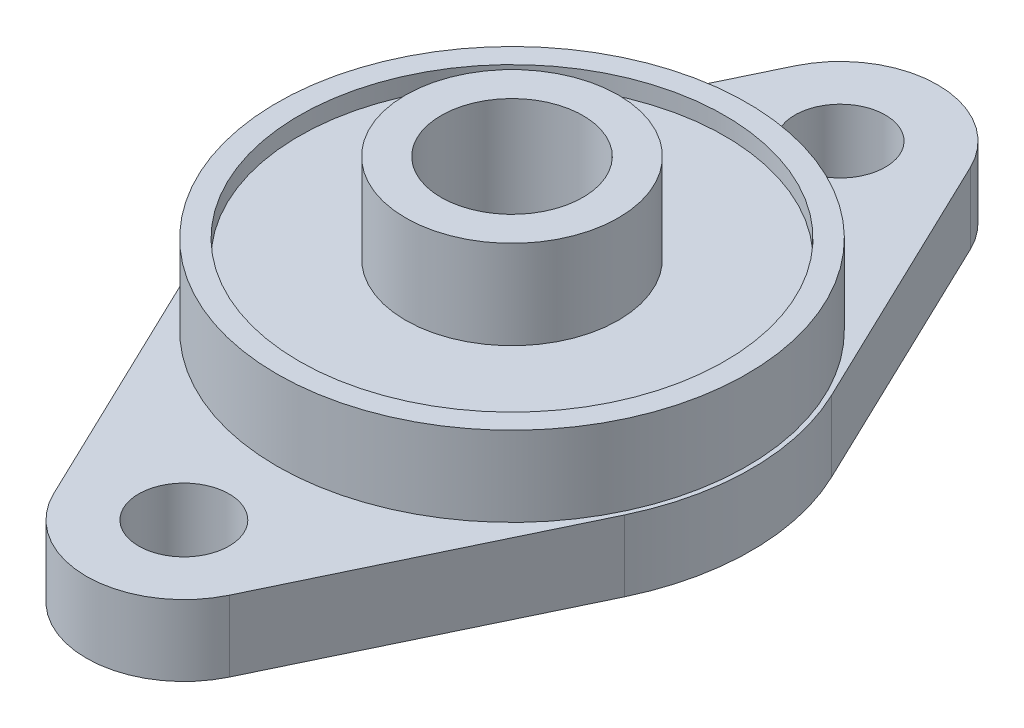
ISO-10303-21;
HEADER;
FILE_DESCRIPTION(('STEP AP214'),'2;1');
FILE_NAME('part.step','',(''),(''),'','','');
FILE_SCHEMA(('AUTOMOTIVE_DESIGN { 1 0 10303 214 1 1 1 1 }'));
ENDSEC;
DATA;
#1=APPLICATION_CONTEXT('core data for automotive mechanical design processes');
#2=APPLICATION_PROTOCOL_DEFINITION('international standard','automotive_design',2000,#1);
#3=PRODUCT_CONTEXT('',#1,'mechanical');
#4=PRODUCT('Part','Part','',(#3));
#5=PRODUCT_RELATED_PRODUCT_CATEGORY('part','',(#4));
#6=PRODUCT_DEFINITION_FORMATION('','',#4);
#7=PRODUCT_DEFINITION_CONTEXT('part definition',#1,'design');
#8=PRODUCT_DEFINITION('design','',#6,#7);
#9=PRODUCT_DEFINITION_SHAPE('','',#8);
#10=(LENGTH_UNIT() NAMED_UNIT(*) SI_UNIT(.MILLI.,.METRE.));
#11=(NAMED_UNIT(*) PLANE_ANGLE_UNIT() SI_UNIT($,.RADIAN.));
#12=(NAMED_UNIT(*) SI_UNIT($,.STERADIAN.) SOLID_ANGLE_UNIT());
#13=UNCERTAINTY_MEASURE_WITH_UNIT(LENGTH_MEASURE(1.E-05),#10,'distance_accuracy_value','');
#14=(GEOMETRIC_REPRESENTATION_CONTEXT(3) GLOBAL_UNCERTAINTY_ASSIGNED_CONTEXT((#13)) GLOBAL_UNIT_ASSIGNED_CONTEXT((#10,
#11,#12)) REPRESENTATION_CONTEXT('',''));
#15=CARTESIAN_POINT('',(0.,0.,0.));
#16=DIRECTION('',(0.,0.,1.));
#17=DIRECTION('',(1.,0.,0.));
#18=AXIS2_PLACEMENT_3D('',#15,#16,#17);
#19=CARTESIAN_POINT('',(0.,4.,-18.5));
#20=DIRECTION('',(0.,1.,0.));
#21=DIRECTION('',(0.,0.,1.));
#22=AXIS2_PLACEMENT_3D('',#19,#20,#21);
#23=PLANE('',#22);
#24=CARTESIAN_POINT('',(0.,4.,0.));
#25=DIRECTION('',(0.,1.,0.));
#26=DIRECTION('',(0.,0.,1.));
#27=AXIS2_PLACEMENT_3D('',#24,#25,#26);
#28=CIRCLE('',#27,13.25);
#29=CARTESIAN_POINT('',(0.,4.,13.25));
#30=VERTEX_POINT('',#29);
#31=EDGE_CURVE('E225',#30,#30,#28,.T.);
#32=ORIENTED_EDGE('',*,*,#31,.F.);
#33=EDGE_LOOP('',(#32));
#34=FACE_BOUND('',#33,.T.);
#35=CARTESIAN_POINT('',(0.,4.,-18.5));
#36=DIRECTION('',(0.,1.,0.));
#37=DIRECTION('',(0.,0.,1.));
#38=AXIS2_PLACEMENT_3D('',#35,#36,#37);
#39=CIRCLE('',#38,2.55);
#40=CARTESIAN_POINT('',(0.,4.,-15.95));
#41=VERTEX_POINT('',#40);
#42=EDGE_CURVE('E146',#41,#41,#39,.T.);
#43=ORIENTED_EDGE('',*,*,#42,.F.);
#44=EDGE_LOOP('',(#43));
#45=FACE_BOUND('',#44,.T.);
#46=CARTESIAN_POINT('',(0.,4.,-18.5));
#47=DIRECTION('',(0.,1.,0.));
#48=DIRECTION('',(0.,0.,1.));
#49=AXIS2_PLACEMENT_3D('',#46,#47,#48);
#50=CIRCLE('',#49,5.5);
#51=CARTESIAN_POINT('',(4.95916487820905,4.,-20.8783783783784));
#52=VERTEX_POINT('',#51);
#53=CARTESIAN_POINT('',(-4.95916487820906,4.,-20.8783783783784));
#54=VERTEX_POINT('',#53);
#55=EDGE_CURVE('E164',#52,#54,#50,.T.);
#56=ORIENTED_EDGE('',*,*,#55,.T.);
#57=DIRECTION('',(-0.432432432432432,0.,0.901666341492556));
#58=VECTOR('',#57,1.);
#59=CARTESIAN_POINT('',(-4.95916487820906,4.,-20.8783783783784));
#60=LINE('',#59,#58);
#61=CARTESIAN_POINT('',(-12.1724956101495,4.,-5.83783783783783));
#62=VERTEX_POINT('',#61);
#63=EDGE_CURVE('E100',#54,#62,#60,.T.);
#64=ORIENTED_EDGE('',*,*,#63,.T.);
#65=CARTESIAN_POINT('',(0.,4.,0.));
#66=DIRECTION('',(0.,1.,0.));
#67=DIRECTION('',(0.,0.,1.));
#68=AXIS2_PLACEMENT_3D('',#65,#66,#67);
#69=CIRCLE('',#68,13.5);
#70=CARTESIAN_POINT('',(-12.1724956101495,4.,5.83783783783784));
#71=VERTEX_POINT('',#70);
#72=EDGE_CURVE('E185',#62,#71,#69,.T.);
#73=ORIENTED_EDGE('',*,*,#72,.T.);
#74=DIRECTION('',(0.432432432432432,0.,0.901666341492555));
#75=VECTOR('',#74,1.);
#76=CARTESIAN_POINT('',(-12.1724956101495,4.,5.83783783783784));
#77=LINE('',#76,#75);
#78=CARTESIAN_POINT('',(-4.95916487820905,4.,20.8783783783784));
#79=VERTEX_POINT('',#78);
#80=EDGE_CURVE('E199',#71,#79,#77,.T.);
#81=ORIENTED_EDGE('',*,*,#80,.T.);
#82=CARTESIAN_POINT('',(0.,4.,18.5));
#83=DIRECTION('',(0.,1.,0.));
#84=DIRECTION('',(0.,0.,1.));
#85=AXIS2_PLACEMENT_3D('',#82,#83,#84);
#86=CIRCLE('',#85,5.5);
#87=CARTESIAN_POINT('',(4.95916487820906,4.,20.8783783783784));
#88=VERTEX_POINT('',#87);
#89=EDGE_CURVE('E119',#79,#88,#86,.T.);
#90=ORIENTED_EDGE('',*,*,#89,.T.);
#91=DIRECTION('',(0.432432432432432,0.,-0.901666341492556));
#92=VECTOR('',#91,1.);
#93=CARTESIAN_POINT('',(12.1724956101495,4.,5.83783783783784));
#94=LINE('',#93,#92);
#95=CARTESIAN_POINT('',(12.1724956101495,4.,5.83783783783784));
#96=VERTEX_POINT('',#95);
#97=EDGE_CURVE('E113',#88,#96,#94,.T.);
#98=ORIENTED_EDGE('',*,*,#97,.T.);
#99=CARTESIAN_POINT('',(0.,4.,0.));
#100=DIRECTION('',(0.,1.,0.));
#101=DIRECTION('',(0.,0.,1.));
#102=AXIS2_PLACEMENT_3D('',#99,#100,#101);
#103=CIRCLE('',#102,13.5);
#104=CARTESIAN_POINT('',(12.1724956101495,4.,-5.83783783783784));
#105=VERTEX_POINT('',#104);
#106=EDGE_CURVE('E117',#96,#105,#103,.T.);
#107=ORIENTED_EDGE('',*,*,#106,.T.);
#108=DIRECTION('',(-0.432432432432433,0.,-0.901666341492555));
#109=VECTOR('',#108,1.);
#110=CARTESIAN_POINT('',(4.95916487820905,4.,-20.8783783783784));
#111=LINE('',#110,#109);
#112=EDGE_CURVE('E57',#105,#52,#111,.T.);
#113=ORIENTED_EDGE('',*,*,#112,.T.);
#114=EDGE_LOOP('',(#56,#64,#73,#81,#90,#98,#107,#113));
#115=FACE_BOUND('',#114,.T.);
#116=CARTESIAN_POINT('',(0.,4.,18.5));
#117=DIRECTION('',(0.,1.,0.));
#118=DIRECTION('',(0.,0.,1.));
#119=AXIS2_PLACEMENT_3D('',#116,#117,#118);
#120=CIRCLE('',#119,2.55);
#121=CARTESIAN_POINT('',(0.,4.,21.05));
#122=VERTEX_POINT('',#121);
#123=EDGE_CURVE('E213',#122,#122,#120,.T.);
#124=ORIENTED_EDGE('',*,*,#123,.F.);
#125=EDGE_LOOP('',(#124));
#126=FACE_BOUND('',#125,.T.);
#127=ADVANCED_FACE('F39',(#34,#45,#115,#126),#23,.T.);
#128=CARTESIAN_POINT('',(0.,0.,-18.5));
#129=DIRECTION('',(0.,1.,0.));
#130=DIRECTION('',(0.,0.,1.));
#131=AXIS2_PLACEMENT_3D('',#128,#129,#130);
#132=PLANE('',#131);
#133=CARTESIAN_POINT('',(0.,0.,0.));
#134=DIRECTION('',(0.,1.,0.));
#135=DIRECTION('',(0.,0.,1.));
#136=AXIS2_PLACEMENT_3D('',#133,#134,#135);
#137=CIRCLE('',#136,4.);
#138=CARTESIAN_POINT('',(0.,0.,4.));
#139=VERTEX_POINT('',#138);
#140=EDGE_CURVE('E245',#139,#139,#137,.T.);
#141=ORIENTED_EDGE('',*,*,#140,.T.);
#142=EDGE_LOOP('',(#141));
#143=FACE_BOUND('',#142,.T.);
#144=CARTESIAN_POINT('',(0.,0.,-18.5));
#145=DIRECTION('',(0.,1.,0.));
#146=DIRECTION('',(0.,0.,1.));
#147=AXIS2_PLACEMENT_3D('',#144,#145,#146);
#148=CIRCLE('',#147,5.5);
#149=CARTESIAN_POINT('',(4.95916487820905,0.,-20.8783783783784));
#150=VERTEX_POINT('',#149);
#151=CARTESIAN_POINT('',(-4.95916487820906,0.,-20.8783783783784));
#152=VERTEX_POINT('',#151);
#153=EDGE_CURVE('E141',#150,#152,#148,.T.);
#154=ORIENTED_EDGE('',*,*,#153,.F.);
#155=DIRECTION('',(-0.432432432432433,0.,-0.901666341492555));
#156=VECTOR('',#155,1.);
#157=CARTESIAN_POINT('',(4.95916487820905,0.,-20.8783783783784));
#158=LINE('',#157,#156);
#159=CARTESIAN_POINT('',(12.1724956101495,0.,-5.83783783783784));
#160=VERTEX_POINT('',#159);
#161=EDGE_CURVE('E92',#160,#150,#158,.T.);
#162=ORIENTED_EDGE('',*,*,#161,.F.);
#163=CARTESIAN_POINT('',(0.,0.,0.));
#164=DIRECTION('',(0.,1.,0.));
#165=DIRECTION('',(0.,0.,1.));
#166=AXIS2_PLACEMENT_3D('',#163,#164,#165);
#167=CIRCLE('',#166,13.5);
#168=CARTESIAN_POINT('',(12.1724956101495,0.,5.83783783783784));
#169=VERTEX_POINT('',#168);
#170=EDGE_CURVE('E86',#169,#160,#167,.T.);
#171=ORIENTED_EDGE('',*,*,#170,.F.);
#172=DIRECTION('',(0.432432432432432,0.,-0.901666341492556));
#173=VECTOR('',#172,1.);
#174=CARTESIAN_POINT('',(12.1724956101495,0.,5.83783783783784));
#175=LINE('',#174,#173);
#176=CARTESIAN_POINT('',(4.95916487820906,0.,20.8783783783784));
#177=VERTEX_POINT('',#176);
#178=EDGE_CURVE('E128',#177,#169,#175,.T.);
#179=ORIENTED_EDGE('',*,*,#178,.F.);
#180=CARTESIAN_POINT('',(0.,0.,18.5));
#181=DIRECTION('',(0.,1.,0.));
#182=DIRECTION('',(0.,0.,1.));
#183=AXIS2_PLACEMENT_3D('',#180,#181,#182);
#184=CIRCLE('',#183,5.5);
#185=CARTESIAN_POINT('',(-4.95916487820905,0.,20.8783783783784));
#186=VERTEX_POINT('',#185);
#187=EDGE_CURVE('E155',#186,#177,#184,.T.);
#188=ORIENTED_EDGE('',*,*,#187,.F.);
#189=DIRECTION('',(0.432432432432432,0.,0.901666341492555));
#190=VECTOR('',#189,1.);
#191=CARTESIAN_POINT('',(-12.1724956101495,0.,5.83783783783784));
#192=LINE('',#191,#190);
#193=CARTESIAN_POINT('',(-12.1724956101495,0.,5.83783783783784));
#194=VERTEX_POINT('',#193);
#195=EDGE_CURVE('E152',#194,#186,#192,.T.);
#196=ORIENTED_EDGE('',*,*,#195,.F.);
#197=CARTESIAN_POINT('',(0.,0.,0.));
#198=DIRECTION('',(0.,1.,0.));
#199=DIRECTION('',(0.,0.,1.));
#200=AXIS2_PLACEMENT_3D('',#197,#198,#199);
#201=CIRCLE('',#200,13.5);
#202=CARTESIAN_POINT('',(-12.1724956101495,0.,-5.83783783783783));
#203=VERTEX_POINT('',#202);
#204=EDGE_CURVE('E149',#203,#194,#201,.T.);
#205=ORIENTED_EDGE('',*,*,#204,.F.);
#206=DIRECTION('',(-0.432432432432432,0.,0.901666341492556));
#207=VECTOR('',#206,1.);
#208=CARTESIAN_POINT('',(-4.95916487820906,0.,-20.8783783783784));
#209=LINE('',#208,#207);
#210=EDGE_CURVE('E145',#152,#203,#209,.T.);
#211=ORIENTED_EDGE('',*,*,#210,.F.);
#212=EDGE_LOOP('',(#154,#162,#171,#179,#188,#196,#205,#211));
#213=FACE_BOUND('',#212,.T.);
#214=CARTESIAN_POINT('',(0.,0.,-18.5));
#215=DIRECTION('',(0.,1.,0.));
#216=DIRECTION('',(0.,0.,1.));
#217=AXIS2_PLACEMENT_3D('',#214,#215,#216);
#218=CIRCLE('',#217,2.55);
#219=CARTESIAN_POINT('',(0.,0.,-15.95));
#220=VERTEX_POINT('',#219);
#221=EDGE_CURVE('E209',#220,#220,#218,.T.);
#222=ORIENTED_EDGE('',*,*,#221,.T.);
#223=EDGE_LOOP('',(#222));
#224=FACE_BOUND('',#223,.T.);
#225=CARTESIAN_POINT('',(0.,0.,18.5));
#226=DIRECTION('',(0.,1.,0.));
#227=DIRECTION('',(0.,0.,1.));
#228=AXIS2_PLACEMENT_3D('',#225,#226,#227);
#229=CIRCLE('',#228,2.55);
#230=CARTESIAN_POINT('',(0.,0.,21.05));
#231=VERTEX_POINT('',#230);
#232=EDGE_CURVE('E217',#231,#231,#229,.T.);
#233=ORIENTED_EDGE('',*,*,#232,.T.);
#234=EDGE_LOOP('',(#233));
#235=FACE_BOUND('',#234,.T.);
#236=ADVANCED_FACE('F189',(#143,#213,#224,#235),#132,.F.);
#237=CARTESIAN_POINT('',(0.,4.,-18.5));
#238=DIRECTION('',(0.,-1.,0.));
#239=DIRECTION('',(0.,0.,-1.));
#240=AXIS2_PLACEMENT_3D('',#237,#238,#239);
#241=CYLINDRICAL_SURFACE('',#240,5.5);
#242=ORIENTED_EDGE('',*,*,#153,.T.);
#243=DIRECTION('',(0.,-1.,0.));
#244=VECTOR('',#243,1.);
#245=CARTESIAN_POINT('',(-4.95916487820906,4.,-20.8783783783784));
#246=LINE('',#245,#244);
#247=EDGE_CURVE('E11',#54,#152,#246,.T.);
#248=ORIENTED_EDGE('',*,*,#247,.F.);
#249=ORIENTED_EDGE('',*,*,#55,.F.);
#250=DIRECTION('',(0.,-1.,0.));
#251=VECTOR('',#250,1.);
#252=CARTESIAN_POINT('',(4.95916487820905,4.,-20.8783783783784));
#253=LINE('',#252,#251);
#254=EDGE_CURVE('E137',#52,#150,#253,.T.);
#255=ORIENTED_EDGE('',*,*,#254,.T.);
#256=EDGE_LOOP('',(#242,#248,#249,#255));
#257=FACE_BOUND('',#256,.T.);
#258=ADVANCED_FACE('F41',(#257),#241,.T.);
#259=CARTESIAN_POINT('',(-4.95916487820906,4.,-20.8783783783784));
#260=DIRECTION('',(0.901666341492556,0.,0.432432432432432));
#261=DIRECTION('',(0.432432432432432,0.,-0.901666341492556));
#262=AXIS2_PLACEMENT_3D('',#259,#260,#261);
#263=PLANE('',#262);
#264=ORIENTED_EDGE('',*,*,#210,.T.);
#265=DIRECTION('',(0.,-1.,0.));
#266=VECTOR('',#265,1.);
#267=CARTESIAN_POINT('',(-12.1724956101495,4.,-5.83783783783783));
#268=LINE('',#267,#266);
#269=EDGE_CURVE('E49',#62,#203,#268,.T.);
#270=ORIENTED_EDGE('',*,*,#269,.F.);
#271=ORIENTED_EDGE('',*,*,#63,.F.);
#272=ORIENTED_EDGE('',*,*,#247,.T.);
#273=EDGE_LOOP('',(#264,#270,#271,#272));
#274=FACE_BOUND('',#273,.T.);
#275=ADVANCED_FACE('F334',(#274),#263,.F.);
#276=CARTESIAN_POINT('',(0.,4.,0.));
#277=DIRECTION('',(0.,-1.,0.));
#278=DIRECTION('',(0.,0.,-1.));
#279=AXIS2_PLACEMENT_3D('',#276,#277,#278);
#280=CYLINDRICAL_SURFACE('',#279,13.5);
#281=ORIENTED_EDGE('',*,*,#204,.T.);
#282=DIRECTION('',(0.,-1.,0.));
#283=VECTOR('',#282,1.);
#284=CARTESIAN_POINT('',(-12.1724956101495,4.,5.83783783783784));
#285=LINE('',#284,#283);
#286=EDGE_CURVE('E175',#71,#194,#285,.T.);
#287=ORIENTED_EDGE('',*,*,#286,.F.);
#288=ORIENTED_EDGE('',*,*,#72,.F.);
#289=ORIENTED_EDGE('',*,*,#269,.T.);
#290=EDGE_LOOP('',(#281,#287,#288,#289));
#291=FACE_BOUND('',#290,.T.);
#292=ADVANCED_FACE('F183',(#291),#280,.T.);
#293=CARTESIAN_POINT('',(-12.1724956101495,4.,5.83783783783784));
#294=DIRECTION('',(0.901666341492556,0.,-0.432432432432433));
#295=DIRECTION('',(-0.432432432432433,0.,-0.901666341492556));
#296=AXIS2_PLACEMENT_3D('',#293,#294,#295);
#297=PLANE('',#296);
#298=ORIENTED_EDGE('',*,*,#195,.T.);
#299=DIRECTION('',(0.,-1.,0.));
#300=VECTOR('',#299,1.);
#301=CARTESIAN_POINT('',(-4.95916487820905,4.,20.8783783783784));
#302=LINE('',#301,#300);
#303=EDGE_CURVE('E171',#79,#186,#302,.T.);
#304=ORIENTED_EDGE('',*,*,#303,.F.);
#305=ORIENTED_EDGE('',*,*,#80,.F.);
#306=ORIENTED_EDGE('',*,*,#286,.T.);
#307=EDGE_LOOP('',(#298,#304,#305,#306));
#308=FACE_BOUND('',#307,.T.);
#309=ADVANCED_FACE('F194',(#308),#297,.F.);
#310=CARTESIAN_POINT('',(0.,4.,18.5));
#311=DIRECTION('',(0.,-1.,0.));
#312=DIRECTION('',(0.,0.,-1.));
#313=AXIS2_PLACEMENT_3D('',#310,#311,#312);
#314=CYLINDRICAL_SURFACE('',#313,5.5);
#315=ORIENTED_EDGE('',*,*,#187,.T.);
#316=DIRECTION('',(0.,-1.,0.));
#317=VECTOR('',#316,1.);
#318=CARTESIAN_POINT('',(4.95916487820906,4.,20.8783783783784));
#319=LINE('',#318,#317);
#320=EDGE_CURVE('E130',#88,#177,#319,.T.);
#321=ORIENTED_EDGE('',*,*,#320,.F.);
#322=ORIENTED_EDGE('',*,*,#89,.F.);
#323=ORIENTED_EDGE('',*,*,#303,.T.);
#324=EDGE_LOOP('',(#315,#321,#322,#323));
#325=FACE_BOUND('',#324,.T.);
#326=ADVANCED_FACE('F197',(#325),#314,.T.);
#327=CARTESIAN_POINT('',(12.1724956101495,4.,5.83783783783784));
#328=DIRECTION('',(-0.901666341492556,0.,-0.432432432432432));
#329=DIRECTION('',(-0.432432432432432,0.,0.901666341492556));
#330=AXIS2_PLACEMENT_3D('',#327,#328,#329);
#331=PLANE('',#330);
#332=ORIENTED_EDGE('',*,*,#178,.T.);
#333=DIRECTION('',(0.,-1.,0.));
#334=VECTOR('',#333,1.);
#335=CARTESIAN_POINT('',(12.1724956101495,4.,5.83783783783784));
#336=LINE('',#335,#334);
#337=EDGE_CURVE('E125',#96,#169,#336,.T.);
#338=ORIENTED_EDGE('',*,*,#337,.F.);
#339=ORIENTED_EDGE('',*,*,#97,.F.);
#340=ORIENTED_EDGE('',*,*,#320,.T.);
#341=EDGE_LOOP('',(#332,#338,#339,#340));
#342=FACE_BOUND('',#341,.T.);
#343=ADVANCED_FACE('F126',(#342),#331,.F.);
#344=CARTESIAN_POINT('',(0.,4.,0.));
#345=DIRECTION('',(0.,-1.,0.));
#346=DIRECTION('',(0.,0.,-1.));
#347=AXIS2_PLACEMENT_3D('',#344,#345,#346);
#348=CYLINDRICAL_SURFACE('',#347,13.5);
#349=ORIENTED_EDGE('',*,*,#170,.T.);
#350=DIRECTION('',(0.,-1.,0.));
#351=VECTOR('',#350,1.);
#352=CARTESIAN_POINT('',(12.1724956101495,4.,-5.83783783783784));
#353=LINE('',#352,#351);
#354=EDGE_CURVE('E131',#105,#160,#353,.T.);
#355=ORIENTED_EDGE('',*,*,#354,.F.);
#356=ORIENTED_EDGE('',*,*,#106,.F.);
#357=ORIENTED_EDGE('',*,*,#337,.T.);
#358=EDGE_LOOP('',(#349,#355,#356,#357));
#359=FACE_BOUND('',#358,.T.);
#360=ADVANCED_FACE('F133',(#359),#348,.T.);
#361=CARTESIAN_POINT('',(4.95916487820905,4.,-20.8783783783784));
#362=DIRECTION('',(-0.901666341492555,0.,0.432432432432433));
#363=DIRECTION('',(0.432432432432433,0.,0.901666341492555));
#364=AXIS2_PLACEMENT_3D('',#361,#362,#363);
#365=PLANE('',#364);
#366=ORIENTED_EDGE('',*,*,#161,.T.);
#367=ORIENTED_EDGE('',*,*,#254,.F.);
#368=ORIENTED_EDGE('',*,*,#112,.F.);
#369=ORIENTED_EDGE('',*,*,#354,.T.);
#370=EDGE_LOOP('',(#366,#367,#368,#369));
#371=FACE_BOUND('',#370,.T.);
#372=ADVANCED_FACE('F309',(#371),#365,.F.);
#373=CARTESIAN_POINT('',(0.,4.,-18.5));
#374=DIRECTION('',(0.,-1.,0.));
#375=DIRECTION('',(0.,0.,-1.));
#376=AXIS2_PLACEMENT_3D('',#373,#374,#375);
#377=CYLINDRICAL_SURFACE('',#376,2.55);
#378=ORIENTED_EDGE('',*,*,#42,.T.);
#379=EDGE_LOOP('',(#378));
#380=FACE_BOUND('',#379,.T.);
#381=ORIENTED_EDGE('',*,*,#221,.F.);
#382=EDGE_LOOP('',(#381));
#383=FACE_BOUND('',#382,.T.);
#384=ADVANCED_FACE('F306',(#380,#383),#377,.F.);
#385=CARTESIAN_POINT('',(0.,4.,18.5));
#386=DIRECTION('',(0.,-1.,0.));
#387=DIRECTION('',(0.,0.,-1.));
#388=AXIS2_PLACEMENT_3D('',#385,#386,#387);
#389=CYLINDRICAL_SURFACE('',#388,2.55);
#390=ORIENTED_EDGE('',*,*,#123,.T.);
#391=EDGE_LOOP('',(#390));
#392=FACE_BOUND('',#391,.T.);
#393=ORIENTED_EDGE('',*,*,#232,.F.);
#394=EDGE_LOOP('',(#393));
#395=FACE_BOUND('',#394,.T.);
#396=ADVANCED_FACE('F297',(#392,#395),#389,.F.);
#397=CARTESIAN_POINT('',(0.,8.5,0.));
#398=DIRECTION('',(0.,-1.,0.));
#399=DIRECTION('',(0.,0.,-1.));
#400=AXIS2_PLACEMENT_3D('',#397,#398,#399);
#401=CYLINDRICAL_SURFACE('',#400,13.25);
#402=CARTESIAN_POINT('',(0.,8.5,0.));
#403=DIRECTION('',(0.,1.,0.));
#404=DIRECTION('',(0.,0.,1.));
#405=AXIS2_PLACEMENT_3D('',#402,#403,#404);
#406=CIRCLE('',#405,13.25);
#407=CARTESIAN_POINT('',(0.,8.5,13.25));
#408=VERTEX_POINT('',#407);
#409=EDGE_CURVE('E221',#408,#408,#406,.T.);
#410=ORIENTED_EDGE('',*,*,#409,.F.);
#411=EDGE_LOOP('',(#410));
#412=FACE_BOUND('',#411,.T.);
#413=ORIENTED_EDGE('',*,*,#31,.T.);
#414=EDGE_LOOP('',(#413));
#415=FACE_BOUND('',#414,.T.);
#416=ADVANCED_FACE('F291',(#412,#415),#401,.T.);
#417=CARTESIAN_POINT('',(0.,8.5,0.));
#418=DIRECTION('',(0.,1.,0.));
#419=DIRECTION('',(0.,0.,1.));
#420=AXIS2_PLACEMENT_3D('',#417,#418,#419);
#421=PLANE('',#420);
#422=CARTESIAN_POINT('',(0.,8.5,0.));
#423=DIRECTION('',(0.,1.,0.));
#424=DIRECTION('',(0.,0.,1.));
#425=AXIS2_PLACEMENT_3D('',#422,#423,#424);
#426=CIRCLE('',#425,12.);
#427=CARTESIAN_POINT('',(0.,8.5,12.));
#428=VERTEX_POINT('',#427);
#429=EDGE_CURVE('E233',#428,#428,#426,.T.);
#430=ORIENTED_EDGE('',*,*,#429,.F.);
#431=EDGE_LOOP('',(#430));
#432=FACE_BOUND('',#431,.T.);
#433=ORIENTED_EDGE('',*,*,#409,.T.);
#434=EDGE_LOOP('',(#433));
#435=FACE_BOUND('',#434,.T.);
#436=ADVANCED_FACE('F285',(#432,#435),#421,.T.);
#437=CARTESIAN_POINT('',(0.,7.5,0.));
#438=DIRECTION('',(0.,1.,0.));
#439=DIRECTION('',(0.,0.,1.));
#440=AXIS2_PLACEMENT_3D('',#437,#438,#439);
#441=CYLINDRICAL_SURFACE('',#440,12.);
#442=CARTESIAN_POINT('',(0.,7.5,0.));
#443=DIRECTION('',(0.,1.,0.));
#444=DIRECTION('',(0.,0.,1.));
#445=AXIS2_PLACEMENT_3D('',#442,#443,#444);
#446=CIRCLE('',#445,12.);
#447=CARTESIAN_POINT('',(0.,7.5,12.));
#448=VERTEX_POINT('',#447);
#449=EDGE_CURVE('E229',#448,#448,#446,.T.);
#450=ORIENTED_EDGE('',*,*,#449,.F.);
#451=EDGE_LOOP('',(#450));
#452=FACE_BOUND('',#451,.T.);
#453=ORIENTED_EDGE('',*,*,#429,.T.);
#454=EDGE_LOOP('',(#453));
#455=FACE_BOUND('',#454,.T.);
#456=ADVANCED_FACE('F279',(#452,#455),#441,.F.);
#457=CARTESIAN_POINT('',(0.,7.5,0.));
#458=DIRECTION('',(0.,1.,0.));
#459=DIRECTION('',(0.,0.,1.));
#460=AXIS2_PLACEMENT_3D('',#457,#458,#459);
#461=PLANE('',#460);
#462=CARTESIAN_POINT('',(0.,7.5,0.));
#463=DIRECTION('',(0.,1.,0.));
#464=DIRECTION('',(0.,0.,1.));
#465=AXIS2_PLACEMENT_3D('',#462,#463,#464);
#466=CIRCLE('',#465,6.);
#467=CARTESIAN_POINT('',(0.,7.5,6.));
#468=VERTEX_POINT('',#467);
#469=EDGE_CURVE('E241',#468,#468,#466,.T.);
#470=ORIENTED_EDGE('',*,*,#469,.F.);
#471=EDGE_LOOP('',(#470));
#472=FACE_BOUND('',#471,.T.);
#473=ORIENTED_EDGE('',*,*,#449,.T.);
#474=EDGE_LOOP('',(#473));
#475=FACE_BOUND('',#474,.T.);
#476=ADVANCED_FACE('F273',(#472,#475),#461,.T.);
#477=CARTESIAN_POINT('',(0.,12.5,0.));
#478=DIRECTION('',(0.,-1.,0.));
#479=DIRECTION('',(0.,0.,-1.));
#480=AXIS2_PLACEMENT_3D('',#477,#478,#479);
#481=CYLINDRICAL_SURFACE('',#480,6.);
#482=CARTESIAN_POINT('',(0.,12.5,0.));
#483=DIRECTION('',(0.,1.,0.));
#484=DIRECTION('',(0.,0.,1.));
#485=AXIS2_PLACEMENT_3D('',#482,#483,#484);
#486=CIRCLE('',#485,6.);
#487=CARTESIAN_POINT('',(0.,12.5,6.));
#488=VERTEX_POINT('',#487);
#489=EDGE_CURVE('E237',#488,#488,#486,.T.);
#490=ORIENTED_EDGE('',*,*,#489,.F.);
#491=EDGE_LOOP('',(#490));
#492=FACE_BOUND('',#491,.T.);
#493=ORIENTED_EDGE('',*,*,#469,.T.);
#494=EDGE_LOOP('',(#493));
#495=FACE_BOUND('',#494,.T.);
#496=ADVANCED_FACE('F267',(#492,#495),#481,.T.);
#497=CARTESIAN_POINT('',(0.,12.5,0.));
#498=DIRECTION('',(0.,1.,0.));
#499=DIRECTION('',(0.,0.,1.));
#500=AXIS2_PLACEMENT_3D('',#497,#498,#499);
#501=PLANE('',#500);
#502=CARTESIAN_POINT('',(0.,12.5,0.));
#503=DIRECTION('',(0.,1.,0.));
#504=DIRECTION('',(0.,0.,1.));
#505=AXIS2_PLACEMENT_3D('',#502,#503,#504);
#506=CIRCLE('',#505,4.);
#507=CARTESIAN_POINT('',(0.,12.5,4.));
#508=VERTEX_POINT('',#507);
#509=EDGE_CURVE('E249',#508,#508,#506,.T.);
#510=ORIENTED_EDGE('',*,*,#509,.F.);
#511=EDGE_LOOP('',(#510));
#512=FACE_BOUND('',#511,.T.);
#513=ORIENTED_EDGE('',*,*,#489,.T.);
#514=EDGE_LOOP('',(#513));
#515=FACE_BOUND('',#514,.T.);
#516=ADVANCED_FACE('F261',(#512,#515),#501,.T.);
#517=CARTESIAN_POINT('',(0.,0.,0.));
#518=DIRECTION('',(0.,1.,0.));
#519=DIRECTION('',(0.,0.,1.));
#520=AXIS2_PLACEMENT_3D('',#517,#518,#519);
#521=CYLINDRICAL_SURFACE('',#520,4.);
#522=ORIENTED_EDGE('',*,*,#140,.F.);
#523=EDGE_LOOP('',(#522));
#524=FACE_BOUND('',#523,.T.);
#525=ORIENTED_EDGE('',*,*,#509,.T.);
#526=EDGE_LOOP('',(#525));
#527=FACE_BOUND('',#526,.T.);
#528=ADVANCED_FACE('F258',(#524,#527),#521,.F.);
#529=CLOSED_SHELL('',(#127,#236,#258,#275,#292,#309,#326,#343,#360,#372,#384,#396,#416,#436,
#456,#476,#496,#516,#528));
#530=MANIFOLD_SOLID_BREP('B2',#529);
#531=ADVANCED_BREP_SHAPE_REPRESENTATION('',(#18,#530),#14);
#532=SHAPE_DEFINITION_REPRESENTATION(#9,#531);
ENDSEC;
END-ISO-10303-21;
